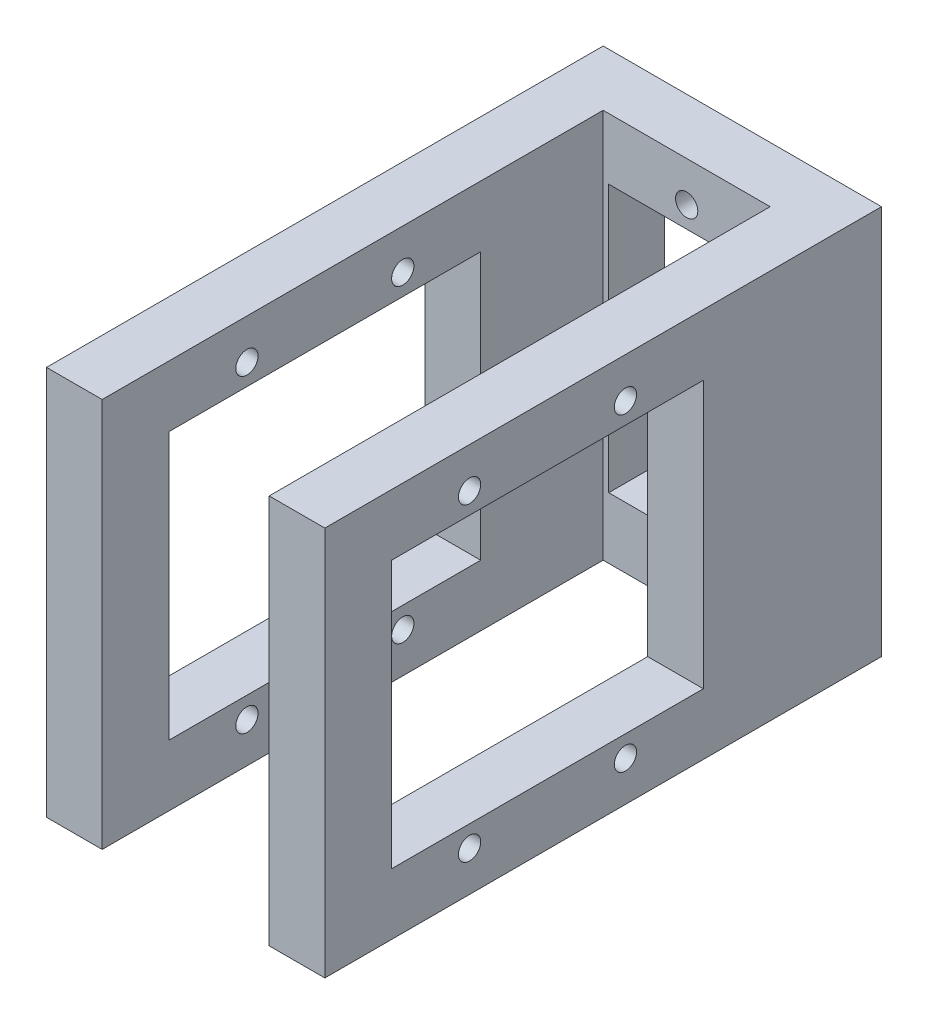
ISO-10303-21;
HEADER;
FILE_DESCRIPTION(('STEP AP214'),'2;1');
FILE_NAME('part.step','',(''),(''),'','','');
FILE_SCHEMA(('AUTOMOTIVE_DESIGN { 1 0 10303 214 1 1 1 1 }'));
ENDSEC;
DATA;
#1=APPLICATION_CONTEXT('core data for automotive mechanical design processes');
#2=APPLICATION_PROTOCOL_DEFINITION('international standard','automotive_design',2000,#1);
#3=PRODUCT_CONTEXT('',#1,'mechanical');
#4=PRODUCT('Part','Part','',(#3));
#5=PRODUCT_RELATED_PRODUCT_CATEGORY('part','',(#4));
#6=PRODUCT_DEFINITION_FORMATION('','',#4);
#7=PRODUCT_DEFINITION_CONTEXT('part definition',#1,'design');
#8=PRODUCT_DEFINITION('design','',#6,#7);
#9=PRODUCT_DEFINITION_SHAPE('','',#8);
#10=(LENGTH_UNIT() NAMED_UNIT(*) SI_UNIT(.MILLI.,.METRE.));
#11=(NAMED_UNIT(*) PLANE_ANGLE_UNIT() SI_UNIT($,.RADIAN.));
#12=(NAMED_UNIT(*) SI_UNIT($,.STERADIAN.) SOLID_ANGLE_UNIT());
#13=UNCERTAINTY_MEASURE_WITH_UNIT(LENGTH_MEASURE(1.E-05),#10,'distance_accuracy_value','');
#14=(GEOMETRIC_REPRESENTATION_CONTEXT(3) GLOBAL_UNCERTAINTY_ASSIGNED_CONTEXT((#13)) GLOBAL_UNIT_ASSIGNED_CONTEXT((#10,
#11,#12)) REPRESENTATION_CONTEXT('',''));
#15=CARTESIAN_POINT('',(0.,0.,0.));
#16=DIRECTION('',(0.,0.,1.));
#17=DIRECTION('',(1.,0.,0.));
#18=AXIS2_PLACEMENT_3D('',#15,#16,#17);
#19=CARTESIAN_POINT('',(-7.5,0.,0.));
#20=DIRECTION('',(1.,0.,0.));
#21=DIRECTION('',(0.,0.,1.));
#22=AXIS2_PLACEMENT_3D('',#19,#20,#21);
#23=PLANE('',#22);
#24=CARTESIAN_POINT('',(-7.5,-13.9,37.));
#25=DIRECTION('',(-1.,0.,0.));
#26=DIRECTION('',(0.,0.,1.));
#27=AXIS2_PLACEMENT_3D('',#24,#25,#26);
#28=CIRCLE('',#27,1.00000000000001);
#29=CARTESIAN_POINT('',(-7.5,-13.9,38.));
#30=VERTEX_POINT('',#29);
#31=EDGE_CURVE('E200',#30,#30,#28,.T.);
#32=ORIENTED_EDGE('',*,*,#31,.T.);
#33=EDGE_LOOP('',(#32));
#34=FACE_BOUND('',#33,.T.);
#35=CARTESIAN_POINT('',(-7.5,13.9,37.));
#36=DIRECTION('',(-1.,0.,0.));
#37=DIRECTION('',(0.,0.,-1.));
#38=AXIS2_PLACEMENT_3D('',#35,#36,#37);
#39=CIRCLE('',#38,1.00000000000001);
#40=CARTESIAN_POINT('',(-7.5,13.9,36.));
#41=VERTEX_POINT('',#40);
#42=EDGE_CURVE('E469',#41,#41,#39,.T.);
#43=ORIENTED_EDGE('',*,*,#42,.T.);
#44=EDGE_LOOP('',(#43));
#45=FACE_BOUND('',#44,.T.);
#46=DIRECTION('',(0.,-1.,0.));
#47=VECTOR('',#46,1.);
#48=CARTESIAN_POINT('',(-7.5,0.,5.));
#49=LINE('',#48,#47);
#50=CARTESIAN_POINT('',(-7.5,17.5,5.));
#51=VERTEX_POINT('',#50);
#52=CARTESIAN_POINT('',(-7.5,-17.5,5.));
#53=VERTEX_POINT('',#52);
#54=EDGE_CURVE('E241',#51,#53,#49,.T.);
#55=ORIENTED_EDGE('',*,*,#54,.F.);
#56=DIRECTION('',(0.,0.,1.));
#57=VECTOR('',#56,1.);
#58=CARTESIAN_POINT('',(-7.5,17.5,0.));
#59=LINE('',#58,#57);
#60=CARTESIAN_POINT('',(-7.5,17.5,50.));
#61=VERTEX_POINT('',#60);
#62=EDGE_CURVE('E221',#51,#61,#59,.T.);
#63=ORIENTED_EDGE('',*,*,#62,.T.);
#64=DIRECTION('',(0.,-1.,0.));
#65=VECTOR('',#64,1.);
#66=CARTESIAN_POINT('',(-7.5,17.5,50.));
#67=LINE('',#66,#65);
#68=CARTESIAN_POINT('',(-7.5,-17.5,50.));
#69=VERTEX_POINT('',#68);
#70=EDGE_CURVE('E233',#61,#69,#67,.T.);
#71=ORIENTED_EDGE('',*,*,#70,.T.);
#72=DIRECTION('',(0.,0.,-1.));
#73=VECTOR('',#72,1.);
#74=CARTESIAN_POINT('',(-7.5,-17.5,0.));
#75=LINE('',#74,#73);
#76=EDGE_CURVE('E213',#69,#53,#75,.T.);
#77=ORIENTED_EDGE('',*,*,#76,.T.);
#78=EDGE_LOOP('',(#55,#63,#71,#77));
#79=FACE_BOUND('',#78,.T.);
#80=DIRECTION('',(0.,0.,1.));
#81=VECTOR('',#80,1.);
#82=CARTESIAN_POINT('',(-7.5,-12.,16.));
#83=LINE('',#82,#81);
#84=CARTESIAN_POINT('',(-7.5,-12.,16.));
#85=VERTEX_POINT('',#84);
#86=CARTESIAN_POINT('',(-7.5,-12.,44.));
#87=VERTEX_POINT('',#86);
#88=EDGE_CURVE('E206',#85,#87,#83,.T.);
#89=ORIENTED_EDGE('',*,*,#88,.T.);
#90=DIRECTION('',(0.,1.,0.));
#91=VECTOR('',#90,1.);
#92=CARTESIAN_POINT('',(-7.5,-12.,44.));
#93=LINE('',#92,#91);
#94=CARTESIAN_POINT('',(-7.5,12.,44.));
#95=VERTEX_POINT('',#94);
#96=EDGE_CURVE('E56',#87,#95,#93,.T.);
#97=ORIENTED_EDGE('',*,*,#96,.T.);
#98=DIRECTION('',(0.,0.,-1.));
#99=VECTOR('',#98,1.);
#100=CARTESIAN_POINT('',(-7.5,12.,16.));
#101=LINE('',#100,#99);
#102=CARTESIAN_POINT('',(-7.5,12.,16.));
#103=VERTEX_POINT('',#102);
#104=EDGE_CURVE('E194',#95,#103,#101,.T.);
#105=ORIENTED_EDGE('',*,*,#104,.T.);
#106=DIRECTION('',(0.,-1.,0.));
#107=VECTOR('',#106,1.);
#108=CARTESIAN_POINT('',(-7.5,-12.,16.));
#109=LINE('',#108,#107);
#110=EDGE_CURVE('E197',#103,#85,#109,.T.);
#111=ORIENTED_EDGE('',*,*,#110,.T.);
#112=EDGE_LOOP('',(#89,#97,#105,#111));
#113=FACE_BOUND('',#112,.T.);
#114=CARTESIAN_POINT('',(-7.5,-13.9,23.));
#115=DIRECTION('',(-1.,0.,0.));
#116=DIRECTION('',(0.,0.,-1.));
#117=AXIS2_PLACEMENT_3D('',#114,#115,#116);
#118=CIRCLE('',#117,1.);
#119=CARTESIAN_POINT('',(-7.5,-13.9,22.));
#120=VERTEX_POINT('',#119);
#121=EDGE_CURVE('E463',#120,#120,#118,.T.);
#122=ORIENTED_EDGE('',*,*,#121,.T.);
#123=EDGE_LOOP('',(#122));
#124=FACE_BOUND('',#123,.T.);
#125=CARTESIAN_POINT('',(-7.5,13.9,23.));
#126=DIRECTION('',(-1.,0.,0.));
#127=DIRECTION('',(0.,0.,1.));
#128=AXIS2_PLACEMENT_3D('',#125,#126,#127);
#129=CIRCLE('',#128,1.);
#130=CARTESIAN_POINT('',(-7.5,13.9,24.));
#131=VERTEX_POINT('',#130);
#132=EDGE_CURVE('E476',#131,#131,#129,.T.);
#133=ORIENTED_EDGE('',*,*,#132,.T.);
#134=EDGE_LOOP('',(#133));
#135=FACE_BOUND('',#134,.T.);
#136=ADVANCED_FACE('F39',(#34,#45,#79,#113,#124,#135),#23,.T.);
#137=CARTESIAN_POINT('',(-12.5,0.,0.));
#138=DIRECTION('',(1.,0.,0.));
#139=DIRECTION('',(0.,0.,1.));
#140=AXIS2_PLACEMENT_3D('',#137,#138,#139);
#141=PLANE('',#140);
#142=DIRECTION('',(0.,1.,0.));
#143=VECTOR('',#142,1.);
#144=CARTESIAN_POINT('',(-12.5,17.5,0.));
#145=LINE('',#144,#143);
#146=CARTESIAN_POINT('',(-12.5,-17.5,0.));
#147=VERTEX_POINT('',#146);
#148=CARTESIAN_POINT('',(-12.5,17.5,0.));
#149=VERTEX_POINT('',#148);
#150=EDGE_CURVE('E217',#147,#149,#145,.T.);
#151=ORIENTED_EDGE('',*,*,#150,.F.);
#152=DIRECTION('',(0.,0.,-1.));
#153=VECTOR('',#152,1.);
#154=CARTESIAN_POINT('',(-12.5,-17.5,0.));
#155=LINE('',#154,#153);
#156=CARTESIAN_POINT('',(-12.5,-17.5,50.));
#157=VERTEX_POINT('',#156);
#158=EDGE_CURVE('E220',#157,#147,#155,.T.);
#159=ORIENTED_EDGE('',*,*,#158,.F.);
#160=DIRECTION('',(0.,-1.,0.));
#161=VECTOR('',#160,1.);
#162=CARTESIAN_POINT('',(-12.5,17.5,50.));
#163=LINE('',#162,#161);
#164=CARTESIAN_POINT('',(-12.5,17.5,50.));
#165=VERTEX_POINT('',#164);
#166=EDGE_CURVE('E224',#165,#157,#163,.T.);
#167=ORIENTED_EDGE('',*,*,#166,.F.);
#168=DIRECTION('',(0.,0.,1.));
#169=VECTOR('',#168,1.);
#170=CARTESIAN_POINT('',(-12.5,17.5,0.));
#171=LINE('',#170,#169);
#172=EDGE_CURVE('E227',#149,#165,#171,.T.);
#173=ORIENTED_EDGE('',*,*,#172,.F.);
#174=EDGE_LOOP('',(#151,#159,#167,#173));
#175=FACE_BOUND('',#174,.T.);
#176=DIRECTION('',(0.,1.,0.));
#177=VECTOR('',#176,1.);
#178=CARTESIAN_POINT('',(-12.5,-12.,44.));
#179=LINE('',#178,#177);
#180=CARTESIAN_POINT('',(-12.5,-12.,44.));
#181=VERTEX_POINT('',#180);
#182=CARTESIAN_POINT('',(-12.5,12.,44.));
#183=VERTEX_POINT('',#182);
#184=EDGE_CURVE('E185',#181,#183,#179,.T.);
#185=ORIENTED_EDGE('',*,*,#184,.F.);
#186=DIRECTION('',(0.,0.,1.));
#187=VECTOR('',#186,1.);
#188=CARTESIAN_POINT('',(-12.5,-12.,16.));
#189=LINE('',#188,#187);
#190=CARTESIAN_POINT('',(-12.5,-12.,16.));
#191=VERTEX_POINT('',#190);
#192=EDGE_CURVE('E177',#191,#181,#189,.T.);
#193=ORIENTED_EDGE('',*,*,#192,.F.);
#194=DIRECTION('',(0.,-1.,0.));
#195=VECTOR('',#194,1.);
#196=CARTESIAN_POINT('',(-12.5,-12.,16.));
#197=LINE('',#196,#195);
#198=CARTESIAN_POINT('',(-12.5,12.,16.));
#199=VERTEX_POINT('',#198);
#200=EDGE_CURVE('E184',#199,#191,#197,.T.);
#201=ORIENTED_EDGE('',*,*,#200,.F.);
#202=DIRECTION('',(0.,0.,-1.));
#203=VECTOR('',#202,1.);
#204=CARTESIAN_POINT('',(-12.5,12.,16.));
#205=LINE('',#204,#203);
#206=EDGE_CURVE('E189',#183,#199,#205,.T.);
#207=ORIENTED_EDGE('',*,*,#206,.F.);
#208=EDGE_LOOP('',(#185,#193,#201,#207));
#209=FACE_BOUND('',#208,.T.);
#210=CARTESIAN_POINT('',(-12.5,13.9,37.));
#211=DIRECTION('',(-1.,0.,0.));
#212=DIRECTION('',(0.,0.,-1.));
#213=AXIS2_PLACEMENT_3D('',#210,#211,#212);
#214=CIRCLE('',#213,1.00000000000001);
#215=CARTESIAN_POINT('',(-12.5,13.9,36.));
#216=VERTEX_POINT('',#215);
#217=EDGE_CURVE('E465',#216,#216,#214,.T.);
#218=ORIENTED_EDGE('',*,*,#217,.F.);
#219=EDGE_LOOP('',(#218));
#220=FACE_BOUND('',#219,.T.);
#221=CARTESIAN_POINT('',(-12.5,-13.9,23.));
#222=DIRECTION('',(-1.,0.,0.));
#223=DIRECTION('',(0.,0.,-1.));
#224=AXIS2_PLACEMENT_3D('',#221,#222,#223);
#225=CIRCLE('',#224,1.);
#226=CARTESIAN_POINT('',(-12.5,-13.9,22.));
#227=VERTEX_POINT('',#226);
#228=EDGE_CURVE('E460',#227,#227,#225,.T.);
#229=ORIENTED_EDGE('',*,*,#228,.F.);
#230=EDGE_LOOP('',(#229));
#231=FACE_BOUND('',#230,.T.);
#232=CARTESIAN_POINT('',(-12.5,-13.9,37.));
#233=DIRECTION('',(-1.,0.,0.));
#234=DIRECTION('',(0.,0.,1.));
#235=AXIS2_PLACEMENT_3D('',#232,#233,#234);
#236=CIRCLE('',#235,1.00000000000001);
#237=CARTESIAN_POINT('',(-12.5,-13.9,38.));
#238=VERTEX_POINT('',#237);
#239=EDGE_CURVE('E478',#238,#238,#236,.T.);
#240=ORIENTED_EDGE('',*,*,#239,.F.);
#241=EDGE_LOOP('',(#240));
#242=FACE_BOUND('',#241,.T.);
#243=CARTESIAN_POINT('',(-12.5,13.9,23.));
#244=DIRECTION('',(-1.,0.,0.));
#245=DIRECTION('',(0.,0.,1.));
#246=AXIS2_PLACEMENT_3D('',#243,#244,#245);
#247=CIRCLE('',#246,1.);
#248=CARTESIAN_POINT('',(-12.5,13.9,24.));
#249=VERTEX_POINT('',#248);
#250=EDGE_CURVE('E207',#249,#249,#247,.T.);
#251=ORIENTED_EDGE('',*,*,#250,.F.);
#252=EDGE_LOOP('',(#251));
#253=FACE_BOUND('',#252,.T.);
#254=ADVANCED_FACE('F192',(#175,#209,#220,#231,#242,#253),#141,.F.);
#255=CARTESIAN_POINT('',(0.,0.,5.));
#256=DIRECTION('',(0.,0.,-1.));
#257=DIRECTION('',(-1.,0.,0.));
#258=AXIS2_PLACEMENT_3D('',#255,#256,#257);
#259=PLANE('',#258);
#260=DIRECTION('',(-1.,0.,0.));
#261=VECTOR('',#260,1.);
#262=CARTESIAN_POINT('',(-10.,17.5,5.));
#263=LINE('',#262,#261);
#264=CARTESIAN_POINT('',(7.5,17.5,5.));
#265=VERTEX_POINT('',#264);
#266=EDGE_CURVE('E48',#265,#51,#263,.T.);
#267=ORIENTED_EDGE('',*,*,#266,.T.);
#268=ORIENTED_EDGE('',*,*,#54,.T.);
#269=DIRECTION('',(1.,0.,0.));
#270=VECTOR('',#269,1.);
#271=CARTESIAN_POINT('',(-10.,-17.5,5.));
#272=LINE('',#271,#270);
#273=CARTESIAN_POINT('',(7.5,-17.5,5.));
#274=VERTEX_POINT('',#273);
#275=EDGE_CURVE('E11',#53,#274,#272,.T.);
#276=ORIENTED_EDGE('',*,*,#275,.T.);
#277=DIRECTION('',(0.,1.,0.));
#278=VECTOR('',#277,1.);
#279=CARTESIAN_POINT('',(7.5,0.,5.));
#280=LINE('',#279,#278);
#281=EDGE_CURVE('E322',#274,#265,#280,.T.);
#282=ORIENTED_EDGE('',*,*,#281,.T.);
#283=EDGE_LOOP('',(#267,#268,#276,#282));
#284=FACE_BOUND('',#283,.T.);
#285=DIRECTION('',(0.,1.,0.));
#286=VECTOR('',#285,1.);
#287=CARTESIAN_POINT('',(7.,-12.,5.));
#288=LINE('',#287,#286);
#289=CARTESIAN_POINT('',(7.,-12.,5.));
#290=VERTEX_POINT('',#289);
#291=CARTESIAN_POINT('',(7.,12.,5.));
#292=VERTEX_POINT('',#291);
#293=EDGE_CURVE('E337',#290,#292,#288,.T.);
#294=ORIENTED_EDGE('',*,*,#293,.F.);
#295=DIRECTION('',(1.,0.,0.));
#296=VECTOR('',#295,1.);
#297=CARTESIAN_POINT('',(-7.,-12.,5.));
#298=LINE('',#297,#296);
#299=CARTESIAN_POINT('',(-7.,-12.,5.));
#300=VERTEX_POINT('',#299);
#301=EDGE_CURVE('E345',#300,#290,#298,.T.);
#302=ORIENTED_EDGE('',*,*,#301,.F.);
#303=DIRECTION('',(0.,-1.,0.));
#304=VECTOR('',#303,1.);
#305=CARTESIAN_POINT('',(-7.,-12.,5.));
#306=LINE('',#305,#304);
#307=CARTESIAN_POINT('',(-7.,12.,5.));
#308=VERTEX_POINT('',#307);
#309=EDGE_CURVE('E342',#308,#300,#306,.T.);
#310=ORIENTED_EDGE('',*,*,#309,.F.);
#311=DIRECTION('',(-1.,0.,0.));
#312=VECTOR('',#311,1.);
#313=CARTESIAN_POINT('',(-7.,12.,5.));
#314=LINE('',#313,#312);
#315=EDGE_CURVE('E339',#292,#308,#314,.T.);
#316=ORIENTED_EDGE('',*,*,#315,.F.);
#317=EDGE_LOOP('',(#294,#302,#310,#316));
#318=FACE_BOUND('',#317,.T.);
#319=CARTESIAN_POINT('',(0.,13.9,5.));
#320=DIRECTION('',(0.,0.,1.));
#321=DIRECTION('',(1.,0.,0.));
#322=AXIS2_PLACEMENT_3D('',#319,#320,#321);
#323=CIRCLE('',#322,1.);
#324=CARTESIAN_POINT('',(0.999999999999999,13.9,5.));
#325=VERTEX_POINT('',#324);
#326=EDGE_CURVE('E331',#325,#325,#323,.T.);
#327=ORIENTED_EDGE('',*,*,#326,.F.);
#328=EDGE_LOOP('',(#327));
#329=FACE_BOUND('',#328,.T.);
#330=CARTESIAN_POINT('',(0.,-13.9,5.));
#331=DIRECTION('',(0.,0.,1.));
#332=DIRECTION('',(-1.,0.,0.));
#333=AXIS2_PLACEMENT_3D('',#330,#331,#332);
#334=CIRCLE('',#333,1.);
#335=CARTESIAN_POINT('',(-0.999999999999993,-13.9,5.));
#336=VERTEX_POINT('',#335);
#337=EDGE_CURVE('E325',#336,#336,#334,.T.);
#338=ORIENTED_EDGE('',*,*,#337,.F.);
#339=EDGE_LOOP('',(#338));
#340=FACE_BOUND('',#339,.T.);
#341=ADVANCED_FACE('F397',(#284,#318,#329,#340),#259,.F.);
#342=CARTESIAN_POINT('',(0.,0.,0.));
#343=DIRECTION('',(0.,0.,-1.));
#344=DIRECTION('',(-1.,0.,0.));
#345=AXIS2_PLACEMENT_3D('',#342,#343,#344);
#346=PLANE('',#345);
#347=DIRECTION('',(0.,1.,0.));
#348=VECTOR('',#347,1.);
#349=CARTESIAN_POINT('',(12.5,17.5,0.));
#350=LINE('',#349,#348);
#351=CARTESIAN_POINT('',(12.5,-17.5,0.));
#352=VERTEX_POINT('',#351);
#353=CARTESIAN_POINT('',(12.5,17.5,0.));
#354=VERTEX_POINT('',#353);
#355=EDGE_CURVE('E300',#352,#354,#350,.T.);
#356=ORIENTED_EDGE('',*,*,#355,.F.);
#357=DIRECTION('',(1.,0.,0.));
#358=VECTOR('',#357,1.);
#359=CARTESIAN_POINT('',(-10.,-17.5,0.));
#360=LINE('',#359,#358);
#361=EDGE_CURVE('E43',#147,#352,#360,.T.);
#362=ORIENTED_EDGE('',*,*,#361,.F.);
#363=ORIENTED_EDGE('',*,*,#150,.T.);
#364=DIRECTION('',(-1.,0.,0.));
#365=VECTOR('',#364,1.);
#366=CARTESIAN_POINT('',(-10.,17.5,0.));
#367=LINE('',#366,#365);
#368=EDGE_CURVE('E367',#354,#149,#367,.T.);
#369=ORIENTED_EDGE('',*,*,#368,.F.);
#370=EDGE_LOOP('',(#356,#362,#363,#369));
#371=FACE_BOUND('',#370,.T.);
#372=CARTESIAN_POINT('',(0.,13.9,0.));
#373=DIRECTION('',(0.,0.,1.));
#374=DIRECTION('',(1.,0.,0.));
#375=AXIS2_PLACEMENT_3D('',#372,#373,#374);
#376=CIRCLE('',#375,1.);
#377=CARTESIAN_POINT('',(0.999999999999999,13.9,0.));
#378=VERTEX_POINT('',#377);
#379=EDGE_CURVE('E328',#378,#378,#376,.T.);
#380=ORIENTED_EDGE('',*,*,#379,.T.);
#381=EDGE_LOOP('',(#380));
#382=FACE_BOUND('',#381,.T.);
#383=DIRECTION('',(1.,0.,0.));
#384=VECTOR('',#383,1.);
#385=CARTESIAN_POINT('',(-7.,-12.,0.));
#386=LINE('',#385,#384);
#387=CARTESIAN_POINT('',(-7.,-12.,0.));
#388=VERTEX_POINT('',#387);
#389=CARTESIAN_POINT('',(7.,-12.,0.));
#390=VERTEX_POINT('',#389);
#391=EDGE_CURVE('E340',#388,#390,#386,.T.);
#392=ORIENTED_EDGE('',*,*,#391,.T.);
#393=DIRECTION('',(0.,1.,0.));
#394=VECTOR('',#393,1.);
#395=CARTESIAN_POINT('',(7.,-12.,0.));
#396=LINE('',#395,#394);
#397=CARTESIAN_POINT('',(7.,12.,0.));
#398=VERTEX_POINT('',#397);
#399=EDGE_CURVE('E334',#390,#398,#396,.T.);
#400=ORIENTED_EDGE('',*,*,#399,.T.);
#401=DIRECTION('',(-1.,0.,0.));
#402=VECTOR('',#401,1.);
#403=CARTESIAN_POINT('',(-7.,12.,0.));
#404=LINE('',#403,#402);
#405=CARTESIAN_POINT('',(-7.,12.,0.));
#406=VERTEX_POINT('',#405);
#407=EDGE_CURVE('E350',#398,#406,#404,.T.);
#408=ORIENTED_EDGE('',*,*,#407,.T.);
#409=DIRECTION('',(0.,-1.,0.));
#410=VECTOR('',#409,1.);
#411=CARTESIAN_POINT('',(-7.,-12.,0.));
#412=LINE('',#411,#410);
#413=EDGE_CURVE('E353',#406,#388,#412,.T.);
#414=ORIENTED_EDGE('',*,*,#413,.T.);
#415=EDGE_LOOP('',(#392,#400,#408,#414));
#416=FACE_BOUND('',#415,.T.);
#417=CARTESIAN_POINT('',(0.,-13.9,0.));
#418=DIRECTION('',(0.,0.,1.));
#419=DIRECTION('',(-1.,0.,0.));
#420=AXIS2_PLACEMENT_3D('',#417,#418,#419);
#421=CIRCLE('',#420,1.);
#422=CARTESIAN_POINT('',(-0.999999999999993,-13.9,0.));
#423=VERTEX_POINT('',#422);
#424=EDGE_CURVE('E324',#423,#423,#421,.T.);
#425=ORIENTED_EDGE('',*,*,#424,.T.);
#426=EDGE_LOOP('',(#425));
#427=FACE_BOUND('',#426,.T.);
#428=ADVANCED_FACE('F382',(#371,#382,#416,#427),#346,.T.);
#429=CARTESIAN_POINT('',(-10.,17.5,5.));
#430=DIRECTION('',(0.,-1.,0.));
#431=DIRECTION('',(0.,0.,-1.));
#432=AXIS2_PLACEMENT_3D('',#429,#430,#431);
#433=PLANE('',#432);
#434=ORIENTED_EDGE('',*,*,#62,.F.);
#435=ORIENTED_EDGE('',*,*,#266,.F.);
#436=DIRECTION('',(0.,0.,1.));
#437=VECTOR('',#436,1.);
#438=CARTESIAN_POINT('',(7.5,17.5,0.));
#439=LINE('',#438,#437);
#440=CARTESIAN_POINT('',(7.5,17.5,50.));
#441=VERTEX_POINT('',#440);
#442=EDGE_CURVE('E293',#265,#441,#439,.T.);
#443=ORIENTED_EDGE('',*,*,#442,.T.);
#444=DIRECTION('',(-1.,0.,0.));
#445=VECTOR('',#444,1.);
#446=CARTESIAN_POINT('',(12.5,17.5,50.));
#447=LINE('',#446,#445);
#448=CARTESIAN_POINT('',(12.5,17.5,50.));
#449=VERTEX_POINT('',#448);
#450=EDGE_CURVE('E319',#449,#441,#447,.T.);
#451=ORIENTED_EDGE('',*,*,#450,.F.);
#452=DIRECTION('',(0.,0.,1.));
#453=VECTOR('',#452,1.);
#454=CARTESIAN_POINT('',(12.5,17.5,0.));
#455=LINE('',#454,#453);
#456=EDGE_CURVE('E303',#354,#449,#455,.T.);
#457=ORIENTED_EDGE('',*,*,#456,.F.);
#458=ORIENTED_EDGE('',*,*,#368,.T.);
#459=ORIENTED_EDGE('',*,*,#172,.T.);
#460=DIRECTION('',(1.,0.,0.));
#461=VECTOR('',#460,1.);
#462=CARTESIAN_POINT('',(-12.5,17.5,50.));
#463=LINE('',#462,#461);
#464=EDGE_CURVE('E230',#165,#61,#463,.T.);
#465=ORIENTED_EDGE('',*,*,#464,.T.);
#466=EDGE_LOOP('',(#434,#435,#443,#451,#457,#458,#459,#465));
#467=FACE_BOUND('',#466,.T.);
#468=ADVANCED_FACE('F41',(#467),#433,.F.);
#469=CARTESIAN_POINT('',(-10.,-17.5,5.));
#470=DIRECTION('',(0.,1.,0.));
#471=DIRECTION('',(0.,0.,1.));
#472=AXIS2_PLACEMENT_3D('',#469,#470,#471);
#473=PLANE('',#472);
#474=ORIENTED_EDGE('',*,*,#275,.F.);
#475=ORIENTED_EDGE('',*,*,#76,.F.);
#476=DIRECTION('',(1.,0.,0.));
#477=VECTOR('',#476,1.);
#478=CARTESIAN_POINT('',(-12.5,-17.5,50.));
#479=LINE('',#478,#477);
#480=EDGE_CURVE('E239',#157,#69,#479,.T.);
#481=ORIENTED_EDGE('',*,*,#480,.F.);
#482=ORIENTED_EDGE('',*,*,#158,.T.);
#483=ORIENTED_EDGE('',*,*,#361,.T.);
#484=DIRECTION('',(0.,0.,-1.));
#485=VECTOR('',#484,1.);
#486=CARTESIAN_POINT('',(12.5,-17.5,0.));
#487=LINE('',#486,#485);
#488=CARTESIAN_POINT('',(12.5,-17.5,50.));
#489=VERTEX_POINT('',#488);
#490=EDGE_CURVE('E308',#489,#352,#487,.T.);
#491=ORIENTED_EDGE('',*,*,#490,.F.);
#492=DIRECTION('',(-1.,0.,0.));
#493=VECTOR('',#492,1.);
#494=CARTESIAN_POINT('',(12.5,-17.5,50.));
#495=LINE('',#494,#493);
#496=CARTESIAN_POINT('',(7.5,-17.5,50.));
#497=VERTEX_POINT('',#496);
#498=EDGE_CURVE('E311',#489,#497,#495,.T.);
#499=ORIENTED_EDGE('',*,*,#498,.T.);
#500=DIRECTION('',(0.,0.,-1.));
#501=VECTOR('',#500,1.);
#502=CARTESIAN_POINT('',(7.5,-17.5,0.));
#503=LINE('',#502,#501);
#504=EDGE_CURVE('E304',#497,#274,#503,.T.);
#505=ORIENTED_EDGE('',*,*,#504,.T.);
#506=EDGE_LOOP('',(#474,#475,#481,#482,#483,#491,#499,#505));
#507=FACE_BOUND('',#506,.T.);
#508=ADVANCED_FACE('F373',(#507),#473,.F.);
#509=CARTESIAN_POINT('',(7.,-12.,5.));
#510=DIRECTION('',(-1.,0.,0.));
#511=DIRECTION('',(0.,0.,1.));
#512=AXIS2_PLACEMENT_3D('',#509,#510,#511);
#513=PLANE('',#512);
#514=ORIENTED_EDGE('',*,*,#399,.F.);
#515=DIRECTION('',(0.,0.,-1.));
#516=VECTOR('',#515,1.);
#517=CARTESIAN_POINT('',(7.,-12.,5.));
#518=LINE('',#517,#516);
#519=EDGE_CURVE('E347',#290,#390,#518,.T.);
#520=ORIENTED_EDGE('',*,*,#519,.F.);
#521=ORIENTED_EDGE('',*,*,#293,.T.);
#522=DIRECTION('',(0.,0.,-1.));
#523=VECTOR('',#522,1.);
#524=CARTESIAN_POINT('',(7.,12.,5.));
#525=LINE('',#524,#523);
#526=EDGE_CURVE('E364',#292,#398,#525,.T.);
#527=ORIENTED_EDGE('',*,*,#526,.T.);
#528=EDGE_LOOP('',(#514,#520,#521,#527));
#529=FACE_BOUND('',#528,.T.);
#530=ADVANCED_FACE('F557',(#529),#513,.T.);
#531=CARTESIAN_POINT('',(-7.,12.,5.));
#532=DIRECTION('',(0.,-1.,0.));
#533=DIRECTION('',(0.,0.,-1.));
#534=AXIS2_PLACEMENT_3D('',#531,#532,#533);
#535=PLANE('',#534);
#536=ORIENTED_EDGE('',*,*,#407,.F.);
#537=ORIENTED_EDGE('',*,*,#526,.F.);
#538=ORIENTED_EDGE('',*,*,#315,.T.);
#539=DIRECTION('',(0.,0.,-1.));
#540=VECTOR('',#539,1.);
#541=CARTESIAN_POINT('',(-7.,12.,5.));
#542=LINE('',#541,#540);
#543=EDGE_CURVE('E362',#308,#406,#542,.T.);
#544=ORIENTED_EDGE('',*,*,#543,.T.);
#545=EDGE_LOOP('',(#536,#537,#538,#544));
#546=FACE_BOUND('',#545,.T.);
#547=ADVANCED_FACE('F710',(#546),#535,.T.);
#548=CARTESIAN_POINT('',(-7.,-12.,5.));
#549=DIRECTION('',(1.,0.,0.));
#550=DIRECTION('',(0.,0.,-1.));
#551=AXIS2_PLACEMENT_3D('',#548,#549,#550);
#552=PLANE('',#551);
#553=ORIENTED_EDGE('',*,*,#413,.F.);
#554=ORIENTED_EDGE('',*,*,#543,.F.);
#555=ORIENTED_EDGE('',*,*,#309,.T.);
#556=DIRECTION('',(0.,0.,-1.));
#557=VECTOR('',#556,1.);
#558=CARTESIAN_POINT('',(-7.,-12.,5.));
#559=LINE('',#558,#557);
#560=EDGE_CURVE('E360',#300,#388,#559,.T.);
#561=ORIENTED_EDGE('',*,*,#560,.T.);
#562=EDGE_LOOP('',(#553,#554,#555,#561));
#563=FACE_BOUND('',#562,.T.);
#564=ADVANCED_FACE('F702',(#563),#552,.T.);
#565=CARTESIAN_POINT('',(-7.,-12.,5.));
#566=DIRECTION('',(0.,1.,0.));
#567=DIRECTION('',(0.,0.,1.));
#568=AXIS2_PLACEMENT_3D('',#565,#566,#567);
#569=PLANE('',#568);
#570=ORIENTED_EDGE('',*,*,#391,.F.);
#571=ORIENTED_EDGE('',*,*,#560,.F.);
#572=ORIENTED_EDGE('',*,*,#301,.T.);
#573=ORIENTED_EDGE('',*,*,#519,.T.);
#574=EDGE_LOOP('',(#570,#571,#572,#573));
#575=FACE_BOUND('',#574,.T.);
#576=ADVANCED_FACE('F694',(#575),#569,.T.);
#577=CARTESIAN_POINT('',(0.,13.9,5.));
#578=DIRECTION('',(0.,0.,-1.));
#579=DIRECTION('',(-1.,0.,0.));
#580=AXIS2_PLACEMENT_3D('',#577,#578,#579);
#581=CYLINDRICAL_SURFACE('',#580,1.);
#582=ORIENTED_EDGE('',*,*,#326,.T.);
#583=EDGE_LOOP('',(#582));
#584=FACE_BOUND('',#583,.T.);
#585=ORIENTED_EDGE('',*,*,#379,.F.);
#586=EDGE_LOOP('',(#585));
#587=FACE_BOUND('',#586,.T.);
#588=ADVANCED_FACE('F687',(#584,#587),#581,.F.);
#589=CARTESIAN_POINT('',(0.,-13.9,5.));
#590=DIRECTION('',(0.,0.,-1.));
#591=DIRECTION('',(-1.,0.,0.));
#592=AXIS2_PLACEMENT_3D('',#589,#590,#591);
#593=CYLINDRICAL_SURFACE('',#592,1.);
#594=ORIENTED_EDGE('',*,*,#337,.T.);
#595=EDGE_LOOP('',(#594));
#596=FACE_BOUND('',#595,.T.);
#597=ORIENTED_EDGE('',*,*,#424,.F.);
#598=EDGE_LOOP('',(#597));
#599=FACE_BOUND('',#598,.T.);
#600=ADVANCED_FACE('F669',(#596,#599),#593,.F.);
#601=CARTESIAN_POINT('',(7.5,0.,0.));
#602=DIRECTION('',(-1.,0.,0.));
#603=DIRECTION('',(0.,0.,1.));
#604=AXIS2_PLACEMENT_3D('',#601,#602,#603);
#605=PLANE('',#604);
#606=CARTESIAN_POINT('',(7.5,13.9,23.));
#607=DIRECTION('',(-1.,0.,0.));
#608=DIRECTION('',(0.,0.,1.));
#609=AXIS2_PLACEMENT_3D('',#606,#607,#608);
#610=CIRCLE('',#609,1.);
#611=CARTESIAN_POINT('',(7.5,13.9,24.));
#612=VERTEX_POINT('',#611);
#613=EDGE_CURVE('E260',#612,#612,#610,.T.);
#614=ORIENTED_EDGE('',*,*,#613,.F.);
#615=EDGE_LOOP('',(#614));
#616=FACE_BOUND('',#615,.T.);
#617=CARTESIAN_POINT('',(7.5,-13.9,37.));
#618=DIRECTION('',(-1.,0.,0.));
#619=DIRECTION('',(0.,0.,1.));
#620=AXIS2_PLACEMENT_3D('',#617,#618,#619);
#621=CIRCLE('',#620,1.00000000000001);
#622=CARTESIAN_POINT('',(7.5,-13.9,38.));
#623=VERTEX_POINT('',#622);
#624=EDGE_CURVE('E247',#623,#623,#621,.T.);
#625=ORIENTED_EDGE('',*,*,#624,.F.);
#626=EDGE_LOOP('',(#625));
#627=FACE_BOUND('',#626,.T.);
#628=CARTESIAN_POINT('',(7.5,-13.9,23.));
#629=DIRECTION('',(-1.,0.,0.));
#630=DIRECTION('',(0.,0.,-1.));
#631=AXIS2_PLACEMENT_3D('',#628,#629,#630);
#632=CIRCLE('',#631,1.);
#633=CARTESIAN_POINT('',(7.5,-13.9,22.));
#634=VERTEX_POINT('',#633);
#635=EDGE_CURVE('E248',#634,#634,#632,.T.);
#636=ORIENTED_EDGE('',*,*,#635,.F.);
#637=EDGE_LOOP('',(#636));
#638=FACE_BOUND('',#637,.T.);
#639=CARTESIAN_POINT('',(7.5,13.9,37.));
#640=DIRECTION('',(-1.,0.,0.));
#641=DIRECTION('',(0.,0.,-1.));
#642=AXIS2_PLACEMENT_3D('',#639,#640,#641);
#643=CIRCLE('',#642,1.00000000000001);
#644=CARTESIAN_POINT('',(7.5,13.9,36.));
#645=VERTEX_POINT('',#644);
#646=EDGE_CURVE('E243',#645,#645,#643,.T.);
#647=ORIENTED_EDGE('',*,*,#646,.F.);
#648=EDGE_LOOP('',(#647));
#649=FACE_BOUND('',#648,.T.);
#650=DIRECTION('',(0.,1.,0.));
#651=VECTOR('',#650,1.);
#652=CARTESIAN_POINT('',(7.5,-12.,44.));
#653=LINE('',#652,#651);
#654=CARTESIAN_POINT('',(7.5,-12.,44.));
#655=VERTEX_POINT('',#654);
#656=CARTESIAN_POINT('',(7.5,12.,44.));
#657=VERTEX_POINT('',#656);
#658=EDGE_CURVE('E259',#655,#657,#653,.T.);
#659=ORIENTED_EDGE('',*,*,#658,.F.);
#660=DIRECTION('',(0.,0.,1.));
#661=VECTOR('',#660,1.);
#662=CARTESIAN_POINT('',(7.5,-12.,16.));
#663=LINE('',#662,#661);
#664=CARTESIAN_POINT('',(7.5,-12.,16.));
#665=VERTEX_POINT('',#664);
#666=EDGE_CURVE('E272',#665,#655,#663,.T.);
#667=ORIENTED_EDGE('',*,*,#666,.F.);
#668=DIRECTION('',(0.,-1.,0.));
#669=VECTOR('',#668,1.);
#670=CARTESIAN_POINT('',(7.5,-12.,16.));
#671=LINE('',#670,#669);
#672=CARTESIAN_POINT('',(7.5,12.,16.));
#673=VERTEX_POINT('',#672);
#674=EDGE_CURVE('E286',#673,#665,#671,.T.);
#675=ORIENTED_EDGE('',*,*,#674,.F.);
#676=DIRECTION('',(0.,0.,-1.));
#677=VECTOR('',#676,1.);
#678=CARTESIAN_POINT('',(7.5,12.,16.));
#679=LINE('',#678,#677);
#680=EDGE_CURVE('E283',#657,#673,#679,.T.);
#681=ORIENTED_EDGE('',*,*,#680,.F.);
#682=EDGE_LOOP('',(#659,#667,#675,#681));
#683=FACE_BOUND('',#682,.T.);
#684=ORIENTED_EDGE('',*,*,#281,.F.);
#685=ORIENTED_EDGE('',*,*,#504,.F.);
#686=DIRECTION('',(0.,-1.,0.));
#687=VECTOR('',#686,1.);
#688=CARTESIAN_POINT('',(7.5,17.5,50.));
#689=LINE('',#688,#687);
#690=EDGE_CURVE('E313',#441,#497,#689,.T.);
#691=ORIENTED_EDGE('',*,*,#690,.F.);
#692=ORIENTED_EDGE('',*,*,#442,.F.);
#693=EDGE_LOOP('',(#684,#685,#691,#692));
#694=FACE_BOUND('',#693,.T.);
#695=ADVANCED_FACE('F395',(#616,#627,#638,#649,#683,#694),#605,.T.);
#696=CARTESIAN_POINT('',(12.5,17.5,50.));
#697=DIRECTION('',(0.,0.,-1.));
#698=DIRECTION('',(0.,1.,0.));
#699=AXIS2_PLACEMENT_3D('',#696,#697,#698);
#700=PLANE('',#699);
#701=ORIENTED_EDGE('',*,*,#690,.T.);
#702=ORIENTED_EDGE('',*,*,#498,.F.);
#703=DIRECTION('',(0.,-1.,0.));
#704=VECTOR('',#703,1.);
#705=CARTESIAN_POINT('',(12.5,17.5,50.));
#706=LINE('',#705,#704);
#707=EDGE_CURVE('E306',#449,#489,#706,.T.);
#708=ORIENTED_EDGE('',*,*,#707,.F.);
#709=ORIENTED_EDGE('',*,*,#450,.T.);
#710=EDGE_LOOP('',(#701,#702,#708,#709));
#711=FACE_BOUND('',#710,.T.);
#712=ADVANCED_FACE('F391',(#711),#700,.F.);
#713=CARTESIAN_POINT('',(12.5,0.,0.));
#714=DIRECTION('',(-1.,0.,0.));
#715=DIRECTION('',(0.,0.,1.));
#716=AXIS2_PLACEMENT_3D('',#713,#714,#715);
#717=PLANE('',#716);
#718=CARTESIAN_POINT('',(12.5,13.9,23.));
#719=DIRECTION('',(-1.,0.,0.));
#720=DIRECTION('',(0.,0.,1.));
#721=AXIS2_PLACEMENT_3D('',#718,#719,#720);
#722=CIRCLE('',#721,1.);
#723=CARTESIAN_POINT('',(12.5,13.9,24.));
#724=VERTEX_POINT('',#723);
#725=EDGE_CURVE('E256',#724,#724,#722,.T.);
#726=ORIENTED_EDGE('',*,*,#725,.T.);
#727=EDGE_LOOP('',(#726));
#728=FACE_BOUND('',#727,.T.);
#729=CARTESIAN_POINT('',(12.5,-13.9,37.));
#730=DIRECTION('',(-1.,0.,0.));
#731=DIRECTION('',(0.,0.,1.));
#732=AXIS2_PLACEMENT_3D('',#729,#730,#731);
#733=CIRCLE('',#732,1.00000000000001);
#734=CARTESIAN_POINT('',(12.5,-13.9,38.));
#735=VERTEX_POINT('',#734);
#736=EDGE_CURVE('E263',#735,#735,#733,.T.);
#737=ORIENTED_EDGE('',*,*,#736,.T.);
#738=EDGE_LOOP('',(#737));
#739=FACE_BOUND('',#738,.T.);
#740=CARTESIAN_POINT('',(12.5,-13.9,23.));
#741=DIRECTION('',(-1.,0.,0.));
#742=DIRECTION('',(0.,0.,-1.));
#743=AXIS2_PLACEMENT_3D('',#740,#741,#742);
#744=CIRCLE('',#743,1.);
#745=CARTESIAN_POINT('',(12.5,-13.9,22.));
#746=VERTEX_POINT('',#745);
#747=EDGE_CURVE('E244',#746,#746,#744,.T.);
#748=ORIENTED_EDGE('',*,*,#747,.T.);
#749=EDGE_LOOP('',(#748));
#750=FACE_BOUND('',#749,.T.);
#751=CARTESIAN_POINT('',(12.5,13.9,37.));
#752=DIRECTION('',(-1.,0.,0.));
#753=DIRECTION('',(0.,0.,-1.));
#754=AXIS2_PLACEMENT_3D('',#751,#752,#753);
#755=CIRCLE('',#754,1.00000000000001);
#756=CARTESIAN_POINT('',(12.5,13.9,36.));
#757=VERTEX_POINT('',#756);
#758=EDGE_CURVE('E251',#757,#757,#755,.T.);
#759=ORIENTED_EDGE('',*,*,#758,.T.);
#760=EDGE_LOOP('',(#759));
#761=FACE_BOUND('',#760,.T.);
#762=DIRECTION('',(0.,0.,1.));
#763=VECTOR('',#762,1.);
#764=CARTESIAN_POINT('',(12.5,-12.,16.));
#765=LINE('',#764,#763);
#766=CARTESIAN_POINT('',(12.5,-12.,16.));
#767=VERTEX_POINT('',#766);
#768=CARTESIAN_POINT('',(12.5,-12.,44.));
#769=VERTEX_POINT('',#768);
#770=EDGE_CURVE('E278',#767,#769,#765,.T.);
#771=ORIENTED_EDGE('',*,*,#770,.T.);
#772=DIRECTION('',(0.,1.,0.));
#773=VECTOR('',#772,1.);
#774=CARTESIAN_POINT('',(12.5,-12.,44.));
#775=LINE('',#774,#773);
#776=CARTESIAN_POINT('',(12.5,12.,44.));
#777=VERTEX_POINT('',#776);
#778=EDGE_CURVE('E268',#769,#777,#775,.T.);
#779=ORIENTED_EDGE('',*,*,#778,.T.);
#780=DIRECTION('',(0.,0.,-1.));
#781=VECTOR('',#780,1.);
#782=CARTESIAN_POINT('',(12.5,12.,16.));
#783=LINE('',#782,#781);
#784=CARTESIAN_POINT('',(12.5,12.,16.));
#785=VERTEX_POINT('',#784);
#786=EDGE_CURVE('E271',#777,#785,#783,.T.);
#787=ORIENTED_EDGE('',*,*,#786,.T.);
#788=DIRECTION('',(0.,-1.,0.));
#789=VECTOR('',#788,1.);
#790=CARTESIAN_POINT('',(12.5,-12.,16.));
#791=LINE('',#790,#789);
#792=EDGE_CURVE('E275',#785,#767,#791,.T.);
#793=ORIENTED_EDGE('',*,*,#792,.T.);
#794=EDGE_LOOP('',(#771,#779,#787,#793));
#795=FACE_BOUND('',#794,.T.);
#796=ORIENTED_EDGE('',*,*,#355,.T.);
#797=ORIENTED_EDGE('',*,*,#456,.T.);
#798=ORIENTED_EDGE('',*,*,#707,.T.);
#799=ORIENTED_EDGE('',*,*,#490,.T.);
#800=EDGE_LOOP('',(#796,#797,#798,#799));
#801=FACE_BOUND('',#800,.T.);
#802=ADVANCED_FACE('F379',(#728,#739,#750,#761,#795,#801),#717,.F.);
#803=CARTESIAN_POINT('',(12.5,-12.,44.));
#804=DIRECTION('',(0.,0.,1.));
#805=DIRECTION('',(1.,0.,0.));
#806=AXIS2_PLACEMENT_3D('',#803,#804,#805);
#807=PLANE('',#806);
#808=ORIENTED_EDGE('',*,*,#658,.T.);
#809=DIRECTION('',(-1.,0.,0.));
#810=VECTOR('',#809,1.);
#811=CARTESIAN_POINT('',(12.5,12.,44.));
#812=LINE('',#811,#810);
#813=EDGE_CURVE('E281',#777,#657,#812,.T.);
#814=ORIENTED_EDGE('',*,*,#813,.F.);
#815=ORIENTED_EDGE('',*,*,#778,.F.);
#816=DIRECTION('',(-1.,0.,0.));
#817=VECTOR('',#816,1.);
#818=CARTESIAN_POINT('',(12.5,-12.,44.));
#819=LINE('',#818,#817);
#820=EDGE_CURVE('E291',#769,#655,#819,.T.);
#821=ORIENTED_EDGE('',*,*,#820,.T.);
#822=EDGE_LOOP('',(#808,#814,#815,#821));
#823=FACE_BOUND('',#822,.T.);
#824=ADVANCED_FACE('F638',(#823),#807,.F.);
#825=CARTESIAN_POINT('',(12.5,-12.,16.));
#826=DIRECTION('',(0.,-1.,0.));
#827=DIRECTION('',(0.,0.,-1.));
#828=AXIS2_PLACEMENT_3D('',#825,#826,#827);
#829=PLANE('',#828);
#830=ORIENTED_EDGE('',*,*,#666,.T.);
#831=ORIENTED_EDGE('',*,*,#820,.F.);
#832=ORIENTED_EDGE('',*,*,#770,.F.);
#833=DIRECTION('',(-1.,0.,0.));
#834=VECTOR('',#833,1.);
#835=CARTESIAN_POINT('',(12.5,-12.,16.));
#836=LINE('',#835,#834);
#837=EDGE_CURVE('E294',#767,#665,#836,.T.);
#838=ORIENTED_EDGE('',*,*,#837,.T.);
#839=EDGE_LOOP('',(#830,#831,#832,#838));
#840=FACE_BOUND('',#839,.T.);
#841=ADVANCED_FACE('F629',(#840),#829,.F.);
#842=CARTESIAN_POINT('',(12.5,-12.,16.));
#843=DIRECTION('',(0.,0.,-1.));
#844=DIRECTION('',(0.,1.,0.));
#845=AXIS2_PLACEMENT_3D('',#842,#843,#844);
#846=PLANE('',#845);
#847=ORIENTED_EDGE('',*,*,#674,.T.);
#848=ORIENTED_EDGE('',*,*,#837,.F.);
#849=ORIENTED_EDGE('',*,*,#792,.F.);
#850=DIRECTION('',(-1.,0.,0.));
#851=VECTOR('',#850,1.);
#852=CARTESIAN_POINT('',(12.5,12.,16.));
#853=LINE('',#852,#851);
#854=EDGE_CURVE('E296',#785,#673,#853,.T.);
#855=ORIENTED_EDGE('',*,*,#854,.T.);
#856=EDGE_LOOP('',(#847,#848,#849,#855));
#857=FACE_BOUND('',#856,.T.);
#858=ADVANCED_FACE('F620',(#857),#846,.F.);
#859=CARTESIAN_POINT('',(12.5,12.,16.));
#860=DIRECTION('',(0.,1.,0.));
#861=DIRECTION('',(0.,0.,1.));
#862=AXIS2_PLACEMENT_3D('',#859,#860,#861);
#863=PLANE('',#862);
#864=ORIENTED_EDGE('',*,*,#680,.T.);
#865=ORIENTED_EDGE('',*,*,#854,.F.);
#866=ORIENTED_EDGE('',*,*,#786,.F.);
#867=ORIENTED_EDGE('',*,*,#813,.T.);
#868=EDGE_LOOP('',(#864,#865,#866,#867));
#869=FACE_BOUND('',#868,.T.);
#870=ADVANCED_FACE('F611',(#869),#863,.F.);
#871=CARTESIAN_POINT('',(12.5,13.9,37.));
#872=DIRECTION('',(-1.,0.,0.));
#873=DIRECTION('',(0.,0.,1.));
#874=AXIS2_PLACEMENT_3D('',#871,#872,#873);
#875=CYLINDRICAL_SURFACE('',#874,1.00000000000001);
#876=ORIENTED_EDGE('',*,*,#758,.F.);
#877=EDGE_LOOP('',(#876));
#878=FACE_BOUND('',#877,.T.);
#879=ORIENTED_EDGE('',*,*,#646,.T.);
#880=EDGE_LOOP('',(#879));
#881=FACE_BOUND('',#880,.T.);
#882=ADVANCED_FACE('F603',(#878,#881),#875,.F.);
#883=CARTESIAN_POINT('',(12.5,-13.9,23.));
#884=DIRECTION('',(-1.,0.,0.));
#885=DIRECTION('',(0.,0.,1.));
#886=AXIS2_PLACEMENT_3D('',#883,#884,#885);
#887=CYLINDRICAL_SURFACE('',#886,1.);
#888=ORIENTED_EDGE('',*,*,#747,.F.);
#889=EDGE_LOOP('',(#888));
#890=FACE_BOUND('',#889,.T.);
#891=ORIENTED_EDGE('',*,*,#635,.T.);
#892=EDGE_LOOP('',(#891));
#893=FACE_BOUND('',#892,.T.);
#894=ADVANCED_FACE('F594',(#890,#893),#887,.F.);
#895=CARTESIAN_POINT('',(12.5,-13.9,37.));
#896=DIRECTION('',(-1.,0.,0.));
#897=DIRECTION('',(0.,0.,1.));
#898=AXIS2_PLACEMENT_3D('',#895,#896,#897);
#899=CYLINDRICAL_SURFACE('',#898,1.00000000000001);
#900=ORIENTED_EDGE('',*,*,#736,.F.);
#901=EDGE_LOOP('',(#900));
#902=FACE_BOUND('',#901,.T.);
#903=ORIENTED_EDGE('',*,*,#624,.T.);
#904=EDGE_LOOP('',(#903));
#905=FACE_BOUND('',#904,.T.);
#906=ADVANCED_FACE('F417',(#902,#905),#899,.F.);
#907=CARTESIAN_POINT('',(12.5,13.9,23.));
#908=DIRECTION('',(-1.,0.,0.));
#909=DIRECTION('',(0.,0.,1.));
#910=AXIS2_PLACEMENT_3D('',#907,#908,#909);
#911=CYLINDRICAL_SURFACE('',#910,1.);
#912=ORIENTED_EDGE('',*,*,#725,.F.);
#913=EDGE_LOOP('',(#912));
#914=FACE_BOUND('',#913,.T.);
#915=ORIENTED_EDGE('',*,*,#613,.T.);
#916=EDGE_LOOP('',(#915));
#917=FACE_BOUND('',#916,.T.);
#918=ADVANCED_FACE('F409',(#914,#917),#911,.F.);
#919=CARTESIAN_POINT('',(-12.5,17.5,50.));
#920=DIRECTION('',(0.,0.,1.));
#921=DIRECTION('',(0.,-1.,0.));
#922=AXIS2_PLACEMENT_3D('',#919,#920,#921);
#923=PLANE('',#922);
#924=ORIENTED_EDGE('',*,*,#70,.F.);
#925=ORIENTED_EDGE('',*,*,#464,.F.);
#926=ORIENTED_EDGE('',*,*,#166,.T.);
#927=ORIENTED_EDGE('',*,*,#480,.T.);
#928=EDGE_LOOP('',(#924,#925,#926,#927));
#929=FACE_BOUND('',#928,.T.);
#930=ADVANCED_FACE('F407',(#929),#923,.T.);
#931=CARTESIAN_POINT('',(-12.5,-12.,44.));
#932=DIRECTION('',(0.,0.,-1.));
#933=DIRECTION('',(-1.,0.,0.));
#934=AXIS2_PLACEMENT_3D('',#931,#932,#933);
#935=PLANE('',#934);
#936=ORIENTED_EDGE('',*,*,#96,.F.);
#937=DIRECTION('',(1.,0.,0.));
#938=VECTOR('',#937,1.);
#939=CARTESIAN_POINT('',(-12.5,-12.,44.));
#940=LINE('',#939,#938);
#941=EDGE_CURVE('E179',#181,#87,#940,.T.);
#942=ORIENTED_EDGE('',*,*,#941,.F.);
#943=ORIENTED_EDGE('',*,*,#184,.T.);
#944=DIRECTION('',(1.,0.,0.));
#945=VECTOR('',#944,1.);
#946=CARTESIAN_POINT('',(-12.5,12.,44.));
#947=LINE('',#946,#945);
#948=EDGE_CURVE('E211',#183,#95,#947,.T.);
#949=ORIENTED_EDGE('',*,*,#948,.T.);
#950=EDGE_LOOP('',(#936,#942,#943,#949));
#951=FACE_BOUND('',#950,.T.);
#952=ADVANCED_FACE('F187',(#951),#935,.T.);
#953=CARTESIAN_POINT('',(-12.5,12.,16.));
#954=DIRECTION('',(0.,-1.,0.));
#955=DIRECTION('',(0.,0.,-1.));
#956=AXIS2_PLACEMENT_3D('',#953,#954,#955);
#957=PLANE('',#956);
#958=ORIENTED_EDGE('',*,*,#104,.F.);
#959=ORIENTED_EDGE('',*,*,#948,.F.);
#960=ORIENTED_EDGE('',*,*,#206,.T.);
#961=DIRECTION('',(1.,0.,0.));
#962=VECTOR('',#961,1.);
#963=CARTESIAN_POINT('',(-12.5,12.,16.));
#964=LINE('',#963,#962);
#965=EDGE_CURVE('E214',#199,#103,#964,.T.);
#966=ORIENTED_EDGE('',*,*,#965,.T.);
#967=EDGE_LOOP('',(#958,#959,#960,#966));
#968=FACE_BOUND('',#967,.T.);
#969=ADVANCED_FACE('F415',(#968),#957,.T.);
#970=CARTESIAN_POINT('',(-12.5,-12.,16.));
#971=DIRECTION('',(0.,0.,1.));
#972=DIRECTION('',(0.,-1.,0.));
#973=AXIS2_PLACEMENT_3D('',#970,#971,#972);
#974=PLANE('',#973);
#975=ORIENTED_EDGE('',*,*,#110,.F.);
#976=ORIENTED_EDGE('',*,*,#965,.F.);
#977=ORIENTED_EDGE('',*,*,#200,.T.);
#978=DIRECTION('',(1.,0.,0.));
#979=VECTOR('',#978,1.);
#980=CARTESIAN_POINT('',(-12.5,-12.,16.));
#981=LINE('',#980,#979);
#982=EDGE_CURVE('E64',#191,#85,#981,.T.);
#983=ORIENTED_EDGE('',*,*,#982,.T.);
#984=EDGE_LOOP('',(#975,#976,#977,#983));
#985=FACE_BOUND('',#984,.T.);
#986=ADVANCED_FACE('F434',(#985),#974,.T.);
#987=CARTESIAN_POINT('',(-12.5,-12.,16.));
#988=DIRECTION('',(0.,1.,0.));
#989=DIRECTION('',(0.,0.,1.));
#990=AXIS2_PLACEMENT_3D('',#987,#988,#989);
#991=PLANE('',#990);
#992=ORIENTED_EDGE('',*,*,#88,.F.);
#993=ORIENTED_EDGE('',*,*,#982,.F.);
#994=ORIENTED_EDGE('',*,*,#192,.T.);
#995=ORIENTED_EDGE('',*,*,#941,.T.);
#996=EDGE_LOOP('',(#992,#993,#994,#995));
#997=FACE_BOUND('',#996,.T.);
#998=ADVANCED_FACE('F178',(#997),#991,.T.);
#999=CARTESIAN_POINT('',(-12.5,13.9,37.));
#1000=DIRECTION('',(1.,0.,0.));
#1001=DIRECTION('',(0.,0.,-1.));
#1002=AXIS2_PLACEMENT_3D('',#999,#1000,#1001);
#1003=CYLINDRICAL_SURFACE('',#1002,1.00000000000001);
#1004=ORIENTED_EDGE('',*,*,#217,.T.);
#1005=EDGE_LOOP('',(#1004));
#1006=FACE_BOUND('',#1005,.T.);
#1007=ORIENTED_EDGE('',*,*,#42,.F.);
#1008=EDGE_LOOP('',(#1007));
#1009=FACE_BOUND('',#1008,.T.);
#1010=ADVANCED_FACE('F433',(#1006,#1009),#1003,.F.);
#1011=CARTESIAN_POINT('',(-12.5,-13.9,23.));
#1012=DIRECTION('',(1.,0.,0.));
#1013=DIRECTION('',(0.,0.,-1.));
#1014=AXIS2_PLACEMENT_3D('',#1011,#1012,#1013);
#1015=CYLINDRICAL_SURFACE('',#1014,1.);
#1016=ORIENTED_EDGE('',*,*,#228,.T.);
#1017=EDGE_LOOP('',(#1016));
#1018=FACE_BOUND('',#1017,.T.);
#1019=ORIENTED_EDGE('',*,*,#121,.F.);
#1020=EDGE_LOOP('',(#1019));
#1021=FACE_BOUND('',#1020,.T.);
#1022=ADVANCED_FACE('F445',(#1018,#1021),#1015,.F.);
#1023=CARTESIAN_POINT('',(-12.5,-13.9,37.));
#1024=DIRECTION('',(1.,0.,0.));
#1025=DIRECTION('',(0.,0.,-1.));
#1026=AXIS2_PLACEMENT_3D('',#1023,#1024,#1025);
#1027=CYLINDRICAL_SURFACE('',#1026,1.00000000000001);
#1028=ORIENTED_EDGE('',*,*,#239,.T.);
#1029=EDGE_LOOP('',(#1028));
#1030=FACE_BOUND('',#1029,.T.);
#1031=ORIENTED_EDGE('',*,*,#31,.F.);
#1032=EDGE_LOOP('',(#1031));
#1033=FACE_BOUND('',#1032,.T.);
#1034=ADVANCED_FACE('F441',(#1030,#1033),#1027,.F.);
#1035=CARTESIAN_POINT('',(-12.5,13.9,23.));
#1036=DIRECTION('',(1.,0.,0.));
#1037=DIRECTION('',(0.,0.,-1.));
#1038=AXIS2_PLACEMENT_3D('',#1035,#1036,#1037);
#1039=CYLINDRICAL_SURFACE('',#1038,1.);
#1040=ORIENTED_EDGE('',*,*,#250,.T.);
#1041=EDGE_LOOP('',(#1040));
#1042=FACE_BOUND('',#1041,.T.);
#1043=ORIENTED_EDGE('',*,*,#132,.F.);
#1044=EDGE_LOOP('',(#1043));
#1045=FACE_BOUND('',#1044,.T.);
#1046=ADVANCED_FACE('F444',(#1042,#1045),#1039,.F.);
#1047=CLOSED_SHELL('',(#136,#254,#341,#428,#468,#508,#530,#547,#564,#576,#588,#600,#695,#712,
#802,#824,#841,#858,#870,#882,#894,#906,#918,#930,#952,#969,#986,#998,#1010,#1022,#1034,#1046));
#1048=MANIFOLD_SOLID_BREP('B2',#1047);
#1049=ADVANCED_BREP_SHAPE_REPRESENTATION('',(#18,#1048),#14);
#1050=SHAPE_DEFINITION_REPRESENTATION(#9,#1049);
ENDSEC;
END-ISO-10303-21;
